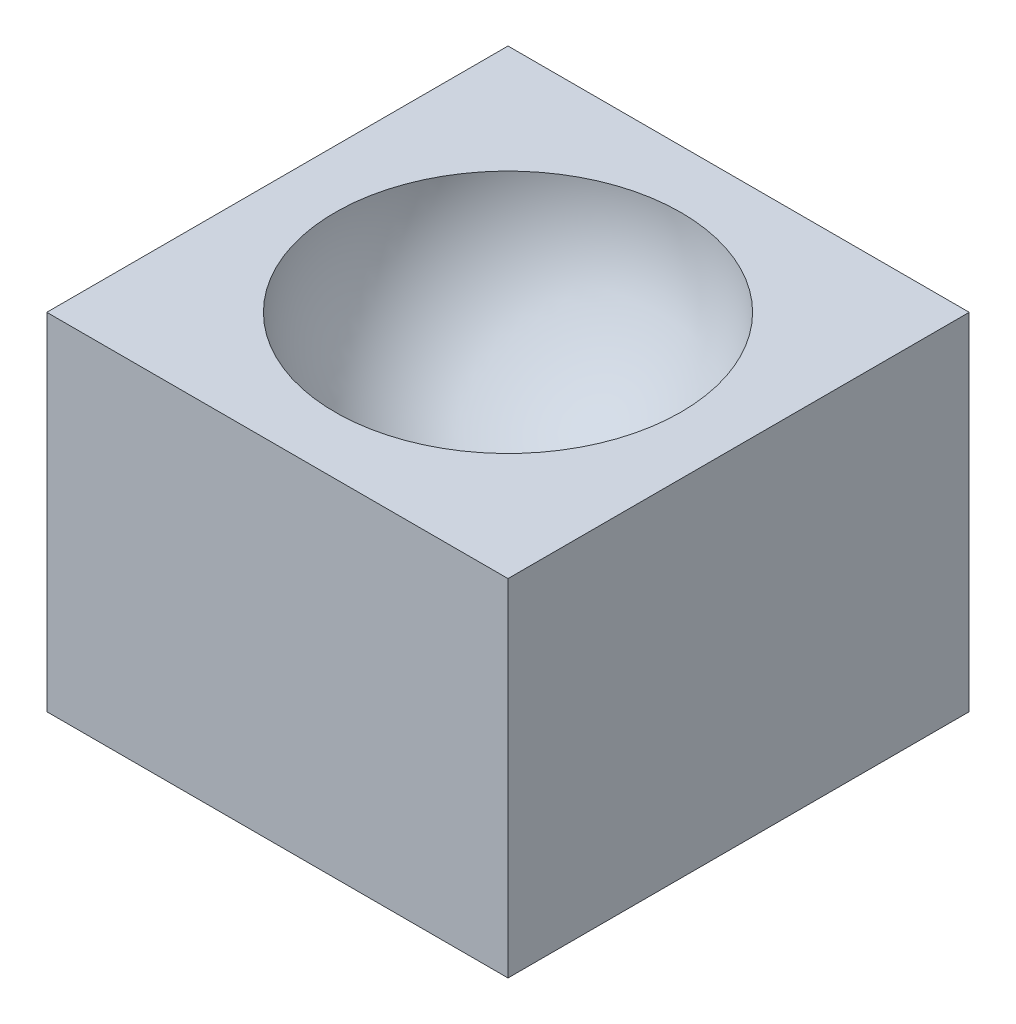
ISO-10303-21;
HEADER;
FILE_DESCRIPTION(('STEP AP214'),'2;1');
FILE_NAME('part.step','',(''),(''),'','','');
FILE_SCHEMA(('AUTOMOTIVE_DESIGN { 1 0 10303 214 1 1 1 1 }'));
ENDSEC;
DATA;
#1=APPLICATION_CONTEXT('core data for automotive mechanical design processes');
#2=APPLICATION_PROTOCOL_DEFINITION('international standard','automotive_design',2000,#1);
#3=PRODUCT_CONTEXT('',#1,'mechanical');
#4=PRODUCT('Part','Part','',(#3));
#5=PRODUCT_RELATED_PRODUCT_CATEGORY('part','',(#4));
#6=PRODUCT_DEFINITION_FORMATION('','',#4);
#7=PRODUCT_DEFINITION_CONTEXT('part definition',#1,'design');
#8=PRODUCT_DEFINITION('design','',#6,#7);
#9=PRODUCT_DEFINITION_SHAPE('','',#8);
#10=(LENGTH_UNIT() NAMED_UNIT(*) SI_UNIT(.MILLI.,.METRE.));
#11=(NAMED_UNIT(*) PLANE_ANGLE_UNIT() SI_UNIT($,.RADIAN.));
#12=(NAMED_UNIT(*) SI_UNIT($,.STERADIAN.) SOLID_ANGLE_UNIT());
#13=UNCERTAINTY_MEASURE_WITH_UNIT(LENGTH_MEASURE(1.E-05),#10,'distance_accuracy_value','');
#14=(GEOMETRIC_REPRESENTATION_CONTEXT(3) GLOBAL_UNCERTAINTY_ASSIGNED_CONTEXT((#13)) GLOBAL_UNIT_ASSIGNED_CONTEXT((#10,
#11,#12)) REPRESENTATION_CONTEXT('',''));
#15=CARTESIAN_POINT('',(0.,0.,0.));
#16=DIRECTION('',(0.,0.,1.));
#17=DIRECTION('',(1.,0.,0.));
#18=AXIS2_PLACEMENT_3D('',#15,#16,#17);
#19=CARTESIAN_POINT('',(0.,15.,0.));
#20=DIRECTION('',(1.,0.,0.));
#21=DIRECTION('',(0.,0.,-1.));
#22=AXIS2_PLACEMENT_3D('',#19,#20,#21);
#23=PLANE('',#22);
#24=DIRECTION('',(0.,0.,1.));
#25=VECTOR('',#24,1.);
#26=CARTESIAN_POINT('',(0.,0.,0.));
#27=LINE('',#26,#25);
#28=CARTESIAN_POINT('',(0.,0.,-20.));
#29=VERTEX_POINT('',#28);
#30=CARTESIAN_POINT('',(0.,0.,0.));
#31=VERTEX_POINT('',#30);
#32=EDGE_CURVE('E98',#29,#31,#27,.T.);
#33=ORIENTED_EDGE('',*,*,#32,.T.);
#34=DIRECTION('',(0.,-1.,0.));
#35=VECTOR('',#34,1.);
#36=CARTESIAN_POINT('',(0.,15.,0.));
#37=LINE('',#36,#35);
#38=CARTESIAN_POINT('',(0.,15.,0.));
#39=VERTEX_POINT('',#38);
#40=EDGE_CURVE('E11',#39,#31,#37,.T.);
#41=ORIENTED_EDGE('',*,*,#40,.F.);
#42=DIRECTION('',(0.,0.,1.));
#43=VECTOR('',#42,1.);
#44=CARTESIAN_POINT('',(0.,15.,0.));
#45=LINE('',#44,#43);
#46=CARTESIAN_POINT('',(0.,15.,-20.));
#47=VERTEX_POINT('',#46);
#48=EDGE_CURVE('E85',#47,#39,#45,.T.);
#49=ORIENTED_EDGE('',*,*,#48,.F.);
#50=DIRECTION('',(0.,-1.,0.));
#51=VECTOR('',#50,1.);
#52=CARTESIAN_POINT('',(0.,15.,-20.));
#53=LINE('',#52,#51);
#54=EDGE_CURVE('E94',#47,#29,#53,.T.);
#55=ORIENTED_EDGE('',*,*,#54,.T.);
#56=EDGE_LOOP('',(#33,#41,#49,#55));
#57=FACE_BOUND('',#56,.T.);
#58=ADVANCED_FACE('F33',(#57),#23,.F.);
#59=CARTESIAN_POINT('',(0.,15.,0.));
#60=DIRECTION('',(0.,0.,-1.));
#61=DIRECTION('',(-1.,0.,0.));
#62=AXIS2_PLACEMENT_3D('',#59,#60,#61);
#63=PLANE('',#62);
#64=DIRECTION('',(1.,0.,0.));
#65=VECTOR('',#64,1.);
#66=CARTESIAN_POINT('',(0.,0.,0.));
#67=LINE('',#66,#65);
#68=CARTESIAN_POINT('',(20.,0.,0.));
#69=VERTEX_POINT('',#68);
#70=EDGE_CURVE('E89',#31,#69,#67,.T.);
#71=ORIENTED_EDGE('',*,*,#70,.T.);
#72=DIRECTION('',(0.,-1.,0.));
#73=VECTOR('',#72,1.);
#74=CARTESIAN_POINT('',(20.,15.,0.));
#75=LINE('',#74,#73);
#76=CARTESIAN_POINT('',(20.,15.,0.));
#77=VERTEX_POINT('',#76);
#78=EDGE_CURVE('E42',#77,#69,#75,.T.);
#79=ORIENTED_EDGE('',*,*,#78,.F.);
#80=DIRECTION('',(1.,0.,0.));
#81=VECTOR('',#80,1.);
#82=CARTESIAN_POINT('',(0.,15.,0.));
#83=LINE('',#82,#81);
#84=EDGE_CURVE('E80',#39,#77,#83,.T.);
#85=ORIENTED_EDGE('',*,*,#84,.F.);
#86=ORIENTED_EDGE('',*,*,#40,.T.);
#87=EDGE_LOOP('',(#71,#79,#85,#86));
#88=FACE_BOUND('',#87,.T.);
#89=ADVANCED_FACE('F88',(#88),#63,.F.);
#90=CARTESIAN_POINT('',(20.,15.,0.));
#91=DIRECTION('',(-1.,0.,0.));
#92=DIRECTION('',(0.,0.,1.));
#93=AXIS2_PLACEMENT_3D('',#90,#91,#92);
#94=PLANE('',#93);
#95=DIRECTION('',(0.,0.,-1.));
#96=VECTOR('',#95,1.);
#97=CARTESIAN_POINT('',(20.,0.,0.));
#98=LINE('',#97,#96);
#99=CARTESIAN_POINT('',(20.,0.,-20.));
#100=VERTEX_POINT('',#99);
#101=EDGE_CURVE('E67',#69,#100,#98,.T.);
#102=ORIENTED_EDGE('',*,*,#101,.T.);
#103=DIRECTION('',(0.,-1.,0.));
#104=VECTOR('',#103,1.);
#105=CARTESIAN_POINT('',(20.,15.,-20.));
#106=LINE('',#105,#104);
#107=CARTESIAN_POINT('',(20.,15.,-20.));
#108=VERTEX_POINT('',#107);
#109=EDGE_CURVE('E90',#108,#100,#106,.T.);
#110=ORIENTED_EDGE('',*,*,#109,.F.);
#111=DIRECTION('',(0.,0.,-1.));
#112=VECTOR('',#111,1.);
#113=CARTESIAN_POINT('',(20.,15.,0.));
#114=LINE('',#113,#112);
#115=EDGE_CURVE('E83',#77,#108,#114,.T.);
#116=ORIENTED_EDGE('',*,*,#115,.F.);
#117=ORIENTED_EDGE('',*,*,#78,.T.);
#118=EDGE_LOOP('',(#102,#110,#116,#117));
#119=FACE_BOUND('',#118,.T.);
#120=ADVANCED_FACE('F92',(#119),#94,.F.);
#121=CARTESIAN_POINT('',(0.,15.,-20.));
#122=DIRECTION('',(0.,0.,1.));
#123=DIRECTION('',(1.,0.,0.));
#124=AXIS2_PLACEMENT_3D('',#121,#122,#123);
#125=PLANE('',#124);
#126=DIRECTION('',(-1.,0.,0.));
#127=VECTOR('',#126,1.);
#128=CARTESIAN_POINT('',(0.,0.,-20.));
#129=LINE('',#128,#127);
#130=EDGE_CURVE('E73',#100,#29,#129,.T.);
#131=ORIENTED_EDGE('',*,*,#130,.T.);
#132=ORIENTED_EDGE('',*,*,#54,.F.);
#133=DIRECTION('',(-1.,0.,0.));
#134=VECTOR('',#133,1.);
#135=CARTESIAN_POINT('',(0.,15.,-20.));
#136=LINE('',#135,#134);
#137=EDGE_CURVE('E50',#108,#47,#136,.T.);
#138=ORIENTED_EDGE('',*,*,#137,.F.);
#139=ORIENTED_EDGE('',*,*,#109,.T.);
#140=EDGE_LOOP('',(#131,#132,#138,#139));
#141=FACE_BOUND('',#140,.T.);
#142=ADVANCED_FACE('F105',(#141),#125,.F.);
#143=CARTESIAN_POINT('',(0.,15.,0.));
#144=DIRECTION('',(0.,-1.,0.));
#145=DIRECTION('',(0.,0.,-1.));
#146=AXIS2_PLACEMENT_3D('',#143,#144,#145);
#147=PLANE('',#146);
#148=CARTESIAN_POINT('',(10.,15.,-10.));
#149=DIRECTION('',(0.,-1.,0.));
#150=DIRECTION('',(0.,0.,-1.));
#151=AXIS2_PLACEMENT_3D('',#148,#149,#150);
#152=CIRCLE('',#151,7.5);
#153=CARTESIAN_POINT('',(10.,15.,-17.5));
#154=VERTEX_POINT('',#153);
#155=EDGE_CURVE('E36',#154,#154,#152,.F.);
#156=ORIENTED_EDGE('',*,*,#155,.F.);
#157=EDGE_LOOP('',(#156));
#158=FACE_BOUND('',#157,.T.);
#159=ORIENTED_EDGE('',*,*,#48,.T.);
#160=ORIENTED_EDGE('',*,*,#84,.T.);
#161=ORIENTED_EDGE('',*,*,#115,.T.);
#162=ORIENTED_EDGE('',*,*,#137,.T.);
#163=EDGE_LOOP('',(#159,#160,#161,#162));
#164=FACE_BOUND('',#163,.T.);
#165=ADVANCED_FACE('F81',(#158,#164),#147,.F.);
#166=CARTESIAN_POINT('',(0.,0.,0.));
#167=DIRECTION('',(0.,-1.,0.));
#168=DIRECTION('',(0.,0.,-1.));
#169=AXIS2_PLACEMENT_3D('',#166,#167,#168);
#170=PLANE('',#169);
#171=CARTESIAN_POINT('',(10.,0.,-10.));
#172=DIRECTION('',(0.,-1.,0.));
#173=DIRECTION('',(0.,0.,-1.));
#174=AXIS2_PLACEMENT_3D('',#171,#172,#173);
#175=CIRCLE('',#174,4.2540047);
#176=CARTESIAN_POINT('',(10.,0.,-14.2540047));
#177=VERTEX_POINT('',#176);
#178=EDGE_CURVE('E111',#177,#177,#175,.T.);
#179=ORIENTED_EDGE('',*,*,#178,.F.);
#180=EDGE_LOOP('',(#179));
#181=FACE_BOUND('',#180,.T.);
#182=ORIENTED_EDGE('',*,*,#32,.F.);
#183=ORIENTED_EDGE('',*,*,#130,.F.);
#184=ORIENTED_EDGE('',*,*,#101,.F.);
#185=ORIENTED_EDGE('',*,*,#70,.F.);
#186=EDGE_LOOP('',(#182,#183,#184,#185));
#187=FACE_BOUND('',#186,.T.);
#188=ADVANCED_FACE('F108',(#181,#187),#170,.T.);
#189=CARTESIAN_POINT('',(10.,15.,-10.));
#190=DIRECTION('',(0.,1.,0.));
#191=DIRECTION('',(1.,0.,0.));
#192=AXIS2_PLACEMENT_3D('',#189,#190,#191);
#193=SPHERICAL_SURFACE('',#192,7.5);
#194=ORIENTED_EDGE('',*,*,#155,.T.);
#195=EDGE_LOOP('',(#194));
#196=FACE_BOUND('',#195,.T.);
#197=ADVANCED_FACE('F121',(#196),#193,.F.);
#198=CARTESIAN_POINT('',(10.,5.,-10.));
#199=DIRECTION('',(0.,-1.,0.));
#200=DIRECTION('',(0.,0.,-1.));
#201=AXIS2_PLACEMENT_3D('',#198,#199,#200);
#202=CYLINDRICAL_SURFACE('',#201,4.2540047);
#203=CARTESIAN_POINT('',(10.,5.,-10.));
#204=DIRECTION('',(0.,-1.,0.));
#205=DIRECTION('',(0.,0.,-1.));
#206=AXIS2_PLACEMENT_3D('',#203,#204,#205);
#207=CIRCLE('',#206,4.2540047);
#208=CARTESIAN_POINT('',(10.,5.,-14.2540047));
#209=VERTEX_POINT('',#208);
#210=EDGE_CURVE('E114',#209,#209,#207,.T.);
#211=ORIENTED_EDGE('',*,*,#210,.F.);
#212=EDGE_LOOP('',(#211));
#213=FACE_BOUND('',#212,.T.);
#214=ORIENTED_EDGE('',*,*,#178,.T.);
#215=EDGE_LOOP('',(#214));
#216=FACE_BOUND('',#215,.T.);
#217=ADVANCED_FACE('F161',(#213,#216),#202,.F.);
#218=CARTESIAN_POINT('',(10.,5.,-10.));
#219=DIRECTION('',(0.,-1.,0.));
#220=DIRECTION('',(0.,0.,-1.));
#221=AXIS2_PLACEMENT_3D('',#218,#219,#220);
#222=PLANE('',#221);
#223=ORIENTED_EDGE('',*,*,#210,.T.);
#224=EDGE_LOOP('',(#223));
#225=FACE_BOUND('',#224,.T.);
#226=ADVANCED_FACE('F174',(#225),#222,.T.);
#227=CLOSED_SHELL('',(#58,#89,#120,#142,#165,#188,#197,#217,#226));
#228=MANIFOLD_SOLID_BREP('B2',#227);
#229=ADVANCED_BREP_SHAPE_REPRESENTATION('',(#18,#228),#14);
#230=SHAPE_DEFINITION_REPRESENTATION(#9,#229);
ENDSEC;
END-ISO-10303-21;
